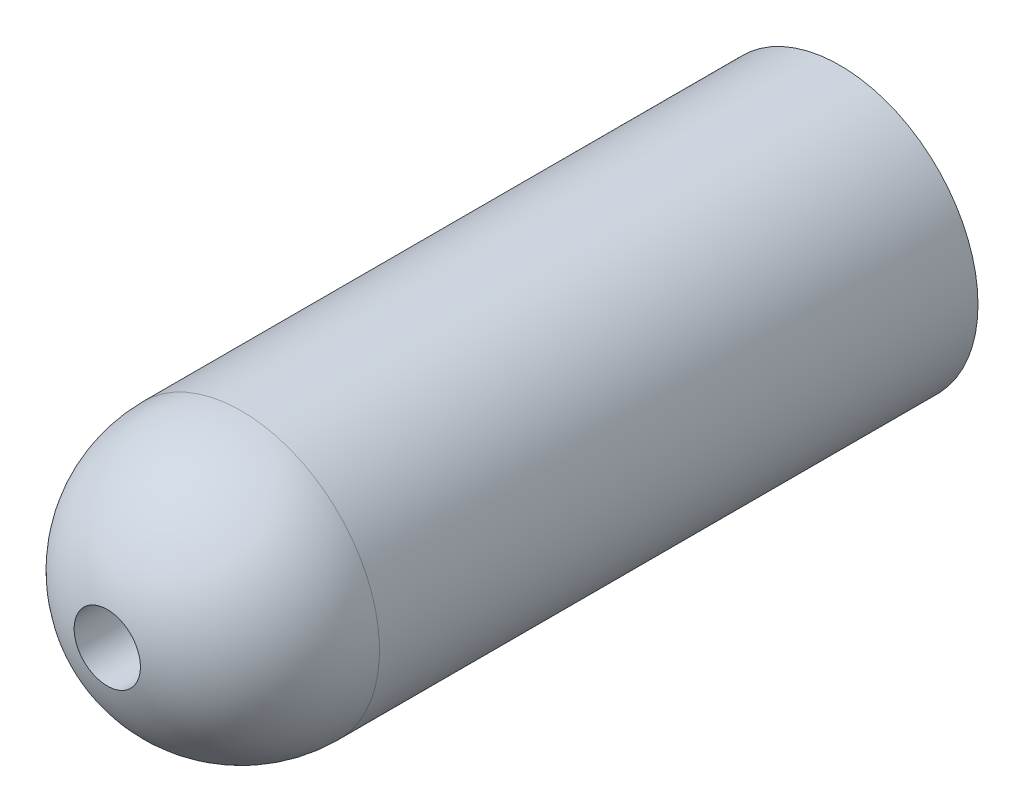
ISO-10303-21;
HEADER;
FILE_DESCRIPTION(('STEP AP214'),'2;1');
FILE_NAME('part.step','',(''),(''),'','','');
FILE_SCHEMA(('AUTOMOTIVE_DESIGN { 1 0 10303 214 1 1 1 1 }'));
ENDSEC;
DATA;
#1=APPLICATION_CONTEXT('core data for automotive mechanical design processes');
#2=APPLICATION_PROTOCOL_DEFINITION('international standard','automotive_design',2000,#1);
#3=PRODUCT_CONTEXT('',#1,'mechanical');
#4=PRODUCT('Part','Part','',(#3));
#5=PRODUCT_RELATED_PRODUCT_CATEGORY('part','',(#4));
#6=PRODUCT_DEFINITION_FORMATION('','',#4);
#7=PRODUCT_DEFINITION_CONTEXT('part definition',#1,'design');
#8=PRODUCT_DEFINITION('design','',#6,#7);
#9=PRODUCT_DEFINITION_SHAPE('','',#8);
#10=(LENGTH_UNIT() NAMED_UNIT(*) SI_UNIT(.MILLI.,.METRE.));
#11=(NAMED_UNIT(*) PLANE_ANGLE_UNIT() SI_UNIT($,.RADIAN.));
#12=(NAMED_UNIT(*) SI_UNIT($,.STERADIAN.) SOLID_ANGLE_UNIT());
#13=UNCERTAINTY_MEASURE_WITH_UNIT(LENGTH_MEASURE(1.E-05),#10,'distance_accuracy_value','');
#14=(GEOMETRIC_REPRESENTATION_CONTEXT(3) GLOBAL_UNCERTAINTY_ASSIGNED_CONTEXT((#13)) GLOBAL_UNIT_ASSIGNED_CONTEXT((#10,
#11,#12)) REPRESENTATION_CONTEXT('',''));
#15=CARTESIAN_POINT('',(0.,0.,0.));
#16=DIRECTION('',(0.,0.,1.));
#17=DIRECTION('',(1.,0.,0.));
#18=AXIS2_PLACEMENT_3D('',#15,#16,#17);
#19=CARTESIAN_POINT('',(0.,0.,25.4));
#20=DIRECTION('',(0.,0.,-1.));
#21=DIRECTION('',(-1.,0.,0.));
#22=AXIS2_PLACEMENT_3D('',#19,#20,#21);
#23=CYLINDRICAL_SURFACE('',#22,4.7625);
#24=CARTESIAN_POINT('',(0.,0.,20.6375));
#25=DIRECTION('',(0.,0.,-1.));
#26=DIRECTION('',(-1.,0.,0.));
#27=AXIS2_PLACEMENT_3D('',#24,#25,#26);
#28=CIRCLE('',#27,4.7625);
#29=CARTESIAN_POINT('',(-4.7625,0.,20.6375));
#30=VERTEX_POINT('',#29);
#31=EDGE_CURVE('E10',#30,#30,#28,.T.);
#32=ORIENTED_EDGE('',*,*,#31,.T.);
#33=EDGE_LOOP('',(#32));
#34=FACE_BOUND('',#33,.T.);
#35=CARTESIAN_POINT('',(0.,0.,0.));
#36=DIRECTION('',(0.,0.,1.));
#37=DIRECTION('',(1.,0.,0.));
#38=AXIS2_PLACEMENT_3D('',#35,#36,#37);
#39=CIRCLE('',#38,4.7625);
#40=CARTESIAN_POINT('',(4.7625,0.,0.));
#41=VERTEX_POINT('',#40);
#42=EDGE_CURVE('E39',#41,#41,#39,.T.);
#43=ORIENTED_EDGE('',*,*,#42,.T.);
#44=EDGE_LOOP('',(#43));
#45=FACE_BOUND('',#44,.T.);
#46=ADVANCED_FACE('F31',(#34,#45),#23,.T.);
#47=CARTESIAN_POINT('',(0.,0.,0.));
#48=DIRECTION('',(0.,0.,1.));
#49=DIRECTION('',(1.,0.,0.));
#50=AXIS2_PLACEMENT_3D('',#47,#48,#49);
#51=PLANE('',#50);
#52=CARTESIAN_POINT('',(0.,0.,0.));
#53=DIRECTION('',(0.,0.,-1.));
#54=DIRECTION('',(-1.,0.,0.));
#55=AXIS2_PLACEMENT_3D('',#52,#53,#54);
#56=CIRCLE('',#55,1.143);
#57=CARTESIAN_POINT('',(-1.143,0.,0.));
#58=VERTEX_POINT('',#57);
#59=EDGE_CURVE('E45',#58,#58,#56,.T.);
#60=ORIENTED_EDGE('',*,*,#59,.F.);
#61=EDGE_LOOP('',(#60));
#62=FACE_BOUND('',#61,.T.);
#63=ORIENTED_EDGE('',*,*,#42,.F.);
#64=EDGE_LOOP('',(#63));
#65=FACE_BOUND('',#64,.T.);
#66=ADVANCED_FACE('F56',(#62,#65),#51,.F.);
#67=CARTESIAN_POINT('',(0.,0.,20.6375));
#68=DIRECTION('',(0.,0.,1.));
#69=DIRECTION('',(1.,0.,0.));
#70=AXIS2_PLACEMENT_3D('',#67,#68,#69);
#71=SPHERICAL_SURFACE('',#70,4.7625);
#72=CARTESIAN_POINT('',(0.,0.,25.2608058789139));
#73=DIRECTION('',(0.,0.,-1.));
#74=DIRECTION('',(-1.,0.,0.));
#75=AXIS2_PLACEMENT_3D('',#72,#73,#74);
#76=CIRCLE('',#75,1.143);
#77=CARTESIAN_POINT('',(-1.143,0.,25.2608058789139));
#78=VERTEX_POINT('',#77);
#79=EDGE_CURVE('E35',#78,#78,#76,.F.);
#80=ORIENTED_EDGE('',*,*,#79,.F.);
#81=EDGE_LOOP('',(#80));
#82=FACE_BOUND('',#81,.T.);
#83=ORIENTED_EDGE('',*,*,#31,.F.);
#84=EDGE_LOOP('',(#83));
#85=FACE_BOUND('',#84,.T.);
#86=ADVANCED_FACE('F33',(#82,#85),#71,.T.);
#87=CARTESIAN_POINT('',(0.,0.,25.4));
#88=DIRECTION('',(0.,0.,-1.));
#89=DIRECTION('',(-1.,0.,0.));
#90=AXIS2_PLACEMENT_3D('',#87,#88,#89);
#91=CYLINDRICAL_SURFACE('',#90,1.143);
#92=ORIENTED_EDGE('',*,*,#79,.T.);
#93=EDGE_LOOP('',(#92));
#94=FACE_BOUND('',#93,.T.);
#95=ORIENTED_EDGE('',*,*,#59,.T.);
#96=EDGE_LOOP('',(#95));
#97=FACE_BOUND('',#96,.T.);
#98=ADVANCED_FACE('F52',(#94,#97),#91,.F.);
#99=CLOSED_SHELL('',(#46,#66,#86,#98));
#100=MANIFOLD_SOLID_BREP('B2',#99);
#101=ADVANCED_BREP_SHAPE_REPRESENTATION('',(#18,#100),#14);
#102=SHAPE_DEFINITION_REPRESENTATION(#9,#101);
ENDSEC;
END-ISO-10303-21;
